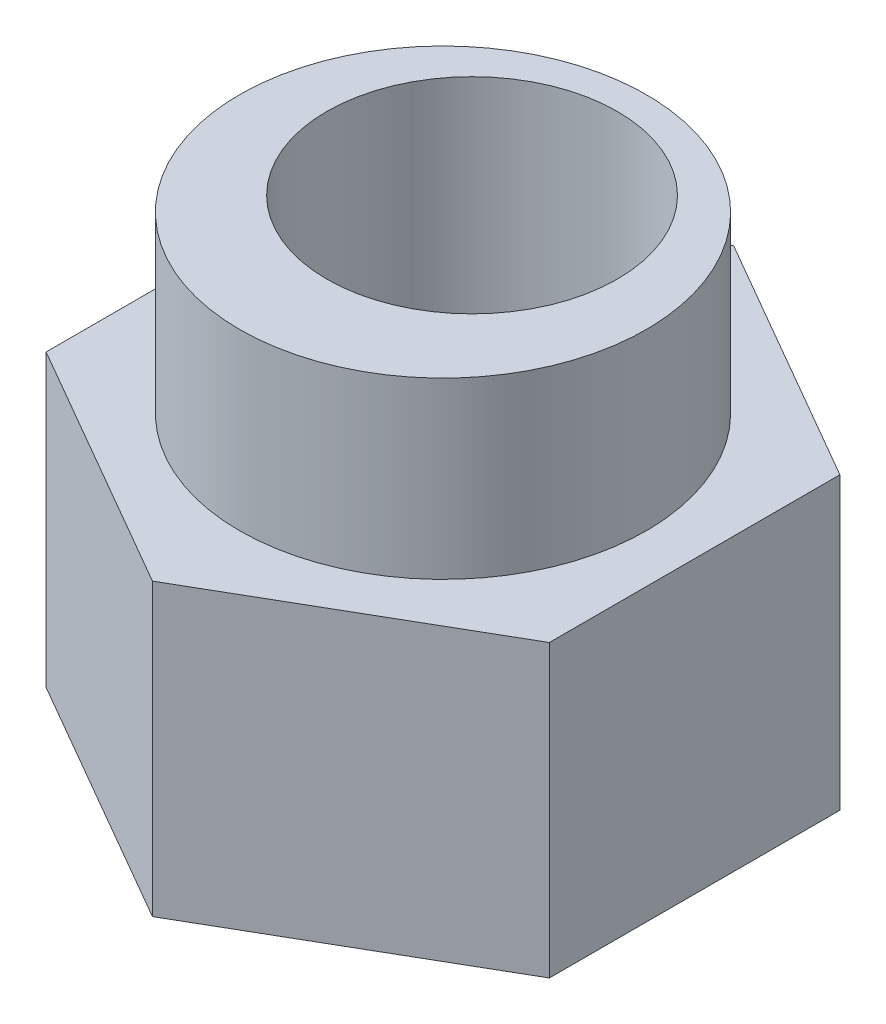
ISO-10303-21;
HEADER;
FILE_DESCRIPTION(('STEP AP214'),'2;1');
FILE_NAME('part.step','',(''),(''),'','','');
FILE_SCHEMA(('AUTOMOTIVE_DESIGN { 1 0 10303 214 1 1 1 1 }'));
ENDSEC;
DATA;
#1=APPLICATION_CONTEXT('core data for automotive mechanical design processes');
#2=APPLICATION_PROTOCOL_DEFINITION('international standard','automotive_design',2000,#1);
#3=PRODUCT_CONTEXT('',#1,'mechanical');
#4=PRODUCT('Part','Part','',(#3));
#5=PRODUCT_RELATED_PRODUCT_CATEGORY('part','',(#4));
#6=PRODUCT_DEFINITION_FORMATION('','',#4);
#7=PRODUCT_DEFINITION_CONTEXT('part definition',#1,'design');
#8=PRODUCT_DEFINITION('design','',#6,#7);
#9=PRODUCT_DEFINITION_SHAPE('','',#8);
#10=(LENGTH_UNIT() NAMED_UNIT(*) SI_UNIT(.MILLI.,.METRE.));
#11=(NAMED_UNIT(*) PLANE_ANGLE_UNIT() SI_UNIT($,.RADIAN.));
#12=(NAMED_UNIT(*) SI_UNIT($,.STERADIAN.) SOLID_ANGLE_UNIT());
#13=UNCERTAINTY_MEASURE_WITH_UNIT(LENGTH_MEASURE(1.E-05),#10,'distance_accuracy_value','');
#14=(GEOMETRIC_REPRESENTATION_CONTEXT(3) GLOBAL_UNCERTAINTY_ASSIGNED_CONTEXT((#13)) GLOBAL_UNIT_ASSIGNED_CONTEXT((#10,
#11,#12)) REPRESENTATION_CONTEXT('',''));
#15=CARTESIAN_POINT('',(0.,0.,0.));
#16=DIRECTION('',(0.,0.,1.));
#17=DIRECTION('',(1.,0.,0.));
#18=AXIS2_PLACEMENT_3D('',#15,#16,#17);
#19=CARTESIAN_POINT('',(4.3301270189222,8.,2.5));
#20=DIRECTION('',(-1.,0.,0.));
#21=DIRECTION('',(0.,0.,1.));
#22=AXIS2_PLACEMENT_3D('',#19,#20,#21);
#23=PLANE('',#22);
#24=DIRECTION('',(0.,0.,-1.));
#25=VECTOR('',#24,1.);
#26=CARTESIAN_POINT('',(4.3301270189222,5.,2.5));
#27=LINE('',#26,#25);
#28=CARTESIAN_POINT('',(4.3301270189222,5.,2.5));
#29=VERTEX_POINT('',#28);
#30=CARTESIAN_POINT('',(4.3301270189222,5.,-2.5));
#31=VERTEX_POINT('',#30);
#32=EDGE_CURVE('E160',#29,#31,#27,.T.);
#33=ORIENTED_EDGE('',*,*,#32,.F.);
#34=DIRECTION('',(0.,-1.,0.));
#35=VECTOR('',#34,1.);
#36=CARTESIAN_POINT('',(4.3301270189222,8.,2.5));
#37=LINE('',#36,#35);
#38=CARTESIAN_POINT('',(4.3301270189222,0.,2.5));
#39=VERTEX_POINT('',#38);
#40=EDGE_CURVE('E66',#29,#39,#37,.T.);
#41=ORIENTED_EDGE('',*,*,#40,.T.);
#42=DIRECTION('',(0.,0.,-1.));
#43=VECTOR('',#42,1.);
#44=CARTESIAN_POINT('',(4.3301270189222,0.,2.5));
#45=LINE('',#44,#43);
#46=CARTESIAN_POINT('',(4.3301270189222,0.,-2.5));
#47=VERTEX_POINT('',#46);
#48=EDGE_CURVE('E147',#39,#47,#45,.T.);
#49=ORIENTED_EDGE('',*,*,#48,.T.);
#50=DIRECTION('',(0.,-1.,0.));
#51=VECTOR('',#50,1.);
#52=CARTESIAN_POINT('',(4.3301270189222,8.,-2.5));
#53=LINE('',#52,#51);
#54=EDGE_CURVE('E11',#31,#47,#53,.T.);
#55=ORIENTED_EDGE('',*,*,#54,.F.);
#56=EDGE_LOOP('',(#33,#41,#49,#55));
#57=FACE_BOUND('',#56,.T.);
#58=ADVANCED_FACE('F43',(#57),#23,.F.);
#59=CARTESIAN_POINT('',(4.3301270189222,8.,-2.5));
#60=DIRECTION('',(-0.5,0.,0.866025403784439));
#61=DIRECTION('',(0.866025403784438,0.,0.5));
#62=AXIS2_PLACEMENT_3D('',#59,#60,#61);
#63=PLANE('',#62);
#64=DIRECTION('',(-0.866025403784438,0.,-0.5));
#65=VECTOR('',#64,1.);
#66=CARTESIAN_POINT('',(4.3301270189222,5.,-2.5));
#67=LINE('',#66,#65);
#68=CARTESIAN_POINT('',(0.,5.,-5.));
#69=VERTEX_POINT('',#68);
#70=EDGE_CURVE('E100',#31,#69,#67,.T.);
#71=ORIENTED_EDGE('',*,*,#70,.F.);
#72=ORIENTED_EDGE('',*,*,#54,.T.);
#73=DIRECTION('',(-0.866025403784438,0.,-0.5));
#74=VECTOR('',#73,1.);
#75=CARTESIAN_POINT('',(4.3301270189222,0.,-2.5));
#76=LINE('',#75,#74);
#77=CARTESIAN_POINT('',(0.,0.,-5.));
#78=VERTEX_POINT('',#77);
#79=EDGE_CURVE('E143',#47,#78,#76,.T.);
#80=ORIENTED_EDGE('',*,*,#79,.T.);
#81=DIRECTION('',(0.,-1.,0.));
#82=VECTOR('',#81,1.);
#83=CARTESIAN_POINT('',(0.,8.,-5.));
#84=LINE('',#83,#82);
#85=EDGE_CURVE('E51',#69,#78,#84,.T.);
#86=ORIENTED_EDGE('',*,*,#85,.F.);
#87=EDGE_LOOP('',(#71,#72,#80,#86));
#88=FACE_BOUND('',#87,.T.);
#89=ADVANCED_FACE('F191',(#88),#63,.F.);
#90=CARTESIAN_POINT('',(0.,8.,-5.));
#91=DIRECTION('',(0.5,0.,0.866025403784438));
#92=DIRECTION('',(0.866025403784438,0.,-0.5));
#93=AXIS2_PLACEMENT_3D('',#90,#91,#92);
#94=PLANE('',#93);
#95=DIRECTION('',(-0.866025403784438,0.,0.5));
#96=VECTOR('',#95,1.);
#97=CARTESIAN_POINT('',(0.,5.,-5.));
#98=LINE('',#97,#96);
#99=CARTESIAN_POINT('',(-4.3301270189222,5.,-2.5));
#100=VERTEX_POINT('',#99);
#101=EDGE_CURVE('E95',#69,#100,#98,.T.);
#102=ORIENTED_EDGE('',*,*,#101,.F.);
#103=ORIENTED_EDGE('',*,*,#85,.T.);
#104=DIRECTION('',(-0.866025403784438,0.,0.5));
#105=VECTOR('',#104,1.);
#106=CARTESIAN_POINT('',(0.,0.,-5.));
#107=LINE('',#106,#105);
#108=CARTESIAN_POINT('',(-4.3301270189222,0.,-2.5));
#109=VERTEX_POINT('',#108);
#110=EDGE_CURVE('E118',#78,#109,#107,.T.);
#111=ORIENTED_EDGE('',*,*,#110,.T.);
#112=DIRECTION('',(0.,-1.,0.));
#113=VECTOR('',#112,1.);
#114=CARTESIAN_POINT('',(-4.3301270189222,8.,-2.5));
#115=LINE('',#114,#113);
#116=EDGE_CURVE('E111',#100,#109,#115,.T.);
#117=ORIENTED_EDGE('',*,*,#116,.F.);
#118=EDGE_LOOP('',(#102,#103,#111,#117));
#119=FACE_BOUND('',#118,.T.);
#120=ADVANCED_FACE('F116',(#119),#94,.F.);
#121=CARTESIAN_POINT('',(-4.3301270189222,8.,-2.5));
#122=DIRECTION('',(1.,0.,0.));
#123=DIRECTION('',(0.,0.,-1.));
#124=AXIS2_PLACEMENT_3D('',#121,#122,#123);
#125=PLANE('',#124);
#126=DIRECTION('',(0.,0.,1.));
#127=VECTOR('',#126,1.);
#128=CARTESIAN_POINT('',(-4.3301270189222,5.,-2.5));
#129=LINE('',#128,#127);
#130=CARTESIAN_POINT('',(-4.33012701892219,5.,2.5));
#131=VERTEX_POINT('',#130);
#132=EDGE_CURVE('E98',#100,#131,#129,.T.);
#133=ORIENTED_EDGE('',*,*,#132,.F.);
#134=ORIENTED_EDGE('',*,*,#116,.T.);
#135=DIRECTION('',(0.,0.,1.));
#136=VECTOR('',#135,1.);
#137=CARTESIAN_POINT('',(-4.3301270189222,0.,-2.5));
#138=LINE('',#137,#136);
#139=CARTESIAN_POINT('',(-4.33012701892219,0.,2.5));
#140=VERTEX_POINT('',#139);
#141=EDGE_CURVE('E138',#109,#140,#138,.T.);
#142=ORIENTED_EDGE('',*,*,#141,.T.);
#143=DIRECTION('',(0.,-1.,0.));
#144=VECTOR('',#143,1.);
#145=CARTESIAN_POINT('',(-4.33012701892219,8.,2.5));
#146=LINE('',#145,#144);
#147=EDGE_CURVE('E113',#131,#140,#146,.T.);
#148=ORIENTED_EDGE('',*,*,#147,.F.);
#149=EDGE_LOOP('',(#133,#134,#142,#148));
#150=FACE_BOUND('',#149,.T.);
#151=ADVANCED_FACE('F109',(#150),#125,.F.);
#152=CARTESIAN_POINT('',(-4.33012701892219,8.,2.5));
#153=DIRECTION('',(0.5,0.,-0.866025403784439));
#154=DIRECTION('',(-0.866025403784439,0.,-0.5));
#155=AXIS2_PLACEMENT_3D('',#152,#153,#154);
#156=PLANE('',#155);
#157=DIRECTION('',(0.866025403784439,0.,0.5));
#158=VECTOR('',#157,1.);
#159=CARTESIAN_POINT('',(-4.33012701892219,5.,2.5));
#160=LINE('',#159,#158);
#161=CARTESIAN_POINT('',(0.,5.,5.));
#162=VERTEX_POINT('',#161);
#163=EDGE_CURVE('E58',#131,#162,#160,.T.);
#164=ORIENTED_EDGE('',*,*,#163,.F.);
#165=ORIENTED_EDGE('',*,*,#147,.T.);
#166=DIRECTION('',(0.866025403784439,0.,0.5));
#167=VECTOR('',#166,1.);
#168=CARTESIAN_POINT('',(-4.33012701892219,0.,2.5));
#169=LINE('',#168,#167);
#170=CARTESIAN_POINT('',(0.,0.,5.));
#171=VERTEX_POINT('',#170);
#172=EDGE_CURVE('E134',#140,#171,#169,.T.);
#173=ORIENTED_EDGE('',*,*,#172,.T.);
#174=DIRECTION('',(0.,-1.,0.));
#175=VECTOR('',#174,1.);
#176=CARTESIAN_POINT('',(0.,8.,5.));
#177=LINE('',#176,#175);
#178=EDGE_CURVE('E124',#162,#171,#177,.T.);
#179=ORIENTED_EDGE('',*,*,#178,.F.);
#180=EDGE_LOOP('',(#164,#165,#173,#179));
#181=FACE_BOUND('',#180,.T.);
#182=ADVANCED_FACE('F206',(#181),#156,.F.);
#183=CARTESIAN_POINT('',(0.,8.,5.));
#184=DIRECTION('',(-0.5,0.,-0.866025403784439));
#185=DIRECTION('',(-0.866025403784439,0.,0.5));
#186=AXIS2_PLACEMENT_3D('',#183,#184,#185);
#187=PLANE('',#186);
#188=DIRECTION('',(0.866025403784438,0.,-0.5));
#189=VECTOR('',#188,1.);
#190=CARTESIAN_POINT('',(0.,5.,5.));
#191=LINE('',#190,#189);
#192=EDGE_CURVE('E163',#162,#29,#191,.T.);
#193=ORIENTED_EDGE('',*,*,#192,.F.);
#194=ORIENTED_EDGE('',*,*,#178,.T.);
#195=DIRECTION('',(0.866025403784438,0.,-0.5));
#196=VECTOR('',#195,1.);
#197=CARTESIAN_POINT('',(0.,0.,5.));
#198=LINE('',#197,#196);
#199=EDGE_CURVE('E131',#171,#39,#198,.T.);
#200=ORIENTED_EDGE('',*,*,#199,.T.);
#201=ORIENTED_EDGE('',*,*,#40,.F.);
#202=EDGE_LOOP('',(#193,#194,#200,#201));
#203=FACE_BOUND('',#202,.T.);
#204=ADVANCED_FACE('F198',(#203),#187,.F.);
#205=CARTESIAN_POINT('',(0.,8.,0.));
#206=DIRECTION('',(0.,1.,0.));
#207=DIRECTION('',(0.,0.,1.));
#208=AXIS2_PLACEMENT_3D('',#205,#206,#207);
#209=PLANE('',#208);
#210=CARTESIAN_POINT('',(0.,8.,-0.500000000000004));
#211=DIRECTION('',(0.,1.,0.));
#212=DIRECTION('',(0.,0.,1.));
#213=AXIS2_PLACEMENT_3D('',#210,#211,#212);
#214=CIRCLE('',#213,2.5);
#215=CARTESIAN_POINT('',(0.,8.,2.));
#216=VERTEX_POINT('',#215);
#217=EDGE_CURVE('E151',#216,#216,#214,.T.);
#218=ORIENTED_EDGE('',*,*,#217,.F.);
#219=EDGE_LOOP('',(#218));
#220=FACE_BOUND('',#219,.T.);
#221=CARTESIAN_POINT('',(0.,8.,0.));
#222=DIRECTION('',(0.,1.,0.));
#223=DIRECTION('',(0.,0.,1.));
#224=AXIS2_PLACEMENT_3D('',#221,#222,#223);
#225=CIRCLE('',#224,3.5);
#226=CARTESIAN_POINT('',(0.,8.,3.5));
#227=VERTEX_POINT('',#226);
#228=EDGE_CURVE('E168',#227,#227,#225,.T.);
#229=ORIENTED_EDGE('',*,*,#228,.T.);
#230=EDGE_LOOP('',(#229));
#231=FACE_BOUND('',#230,.T.);
#232=ADVANCED_FACE('F213',(#220,#231),#209,.T.);
#233=CARTESIAN_POINT('',(0.,0.,0.));
#234=DIRECTION('',(0.,1.,0.));
#235=DIRECTION('',(0.,0.,1.));
#236=AXIS2_PLACEMENT_3D('',#233,#234,#235);
#237=PLANE('',#236);
#238=CARTESIAN_POINT('',(0.,0.,-0.500000000000004));
#239=DIRECTION('',(0.,1.,0.));
#240=DIRECTION('',(0.,0.,1.));
#241=AXIS2_PLACEMENT_3D('',#238,#239,#240);
#242=CIRCLE('',#241,2.5);
#243=CARTESIAN_POINT('',(0.,0.,2.));
#244=VERTEX_POINT('',#243);
#245=EDGE_CURVE('E150',#244,#244,#242,.T.);
#246=ORIENTED_EDGE('',*,*,#245,.T.);
#247=EDGE_LOOP('',(#246));
#248=FACE_BOUND('',#247,.T.);
#249=ORIENTED_EDGE('',*,*,#48,.F.);
#250=ORIENTED_EDGE('',*,*,#199,.F.);
#251=ORIENTED_EDGE('',*,*,#172,.F.);
#252=ORIENTED_EDGE('',*,*,#141,.F.);
#253=ORIENTED_EDGE('',*,*,#110,.F.);
#254=ORIENTED_EDGE('',*,*,#79,.F.);
#255=EDGE_LOOP('',(#249,#250,#251,#252,#253,#254));
#256=FACE_BOUND('',#255,.T.);
#257=ADVANCED_FACE('F187',(#248,#256),#237,.F.);
#258=CARTESIAN_POINT('',(0.,0.,-0.500000000000004));
#259=DIRECTION('',(0.,1.,0.));
#260=DIRECTION('',(0.,0.,1.));
#261=AXIS2_PLACEMENT_3D('',#258,#259,#260);
#262=CYLINDRICAL_SURFACE('',#261,2.5);
#263=ORIENTED_EDGE('',*,*,#245,.F.);
#264=EDGE_LOOP('',(#263));
#265=FACE_BOUND('',#264,.T.);
#266=ORIENTED_EDGE('',*,*,#217,.T.);
#267=EDGE_LOOP('',(#266));
#268=FACE_BOUND('',#267,.T.);
#269=ADVANCED_FACE('F180',(#265,#268),#262,.F.);
#270=CARTESIAN_POINT('',(0.,5.,0.));
#271=DIRECTION('',(0.,1.,0.));
#272=DIRECTION('',(0.,0.,1.));
#273=AXIS2_PLACEMENT_3D('',#270,#271,#272);
#274=PLANE('',#273);
#275=CARTESIAN_POINT('',(0.,5.,0.));
#276=DIRECTION('',(0.,1.,0.));
#277=DIRECTION('',(0.,0.,1.));
#278=AXIS2_PLACEMENT_3D('',#275,#276,#277);
#279=CIRCLE('',#278,3.5);
#280=CARTESIAN_POINT('',(0.,5.,3.5));
#281=VERTEX_POINT('',#280);
#282=EDGE_CURVE('E105',#281,#281,#279,.T.);
#283=ORIENTED_EDGE('',*,*,#282,.F.);
#284=EDGE_LOOP('',(#283));
#285=FACE_BOUND('',#284,.T.);
#286=ORIENTED_EDGE('',*,*,#101,.T.);
#287=ORIENTED_EDGE('',*,*,#132,.T.);
#288=ORIENTED_EDGE('',*,*,#163,.T.);
#289=ORIENTED_EDGE('',*,*,#192,.T.);
#290=ORIENTED_EDGE('',*,*,#32,.T.);
#291=ORIENTED_EDGE('',*,*,#70,.T.);
#292=EDGE_LOOP('',(#286,#287,#288,#289,#290,#291));
#293=FACE_BOUND('',#292,.T.);
#294=ADVANCED_FACE('F97',(#285,#293),#274,.T.);
#295=CARTESIAN_POINT('',(0.,5.,0.));
#296=DIRECTION('',(0.,1.,0.));
#297=DIRECTION('',(0.,0.,1.));
#298=AXIS2_PLACEMENT_3D('',#295,#296,#297);
#299=CYLINDRICAL_SURFACE('',#298,3.5);
#300=ORIENTED_EDGE('',*,*,#282,.T.);
#301=EDGE_LOOP('',(#300));
#302=FACE_BOUND('',#301,.T.);
#303=ORIENTED_EDGE('',*,*,#228,.F.);
#304=EDGE_LOOP('',(#303));
#305=FACE_BOUND('',#304,.T.);
#306=ADVANCED_FACE('F176',(#302,#305),#299,.T.);
#307=CLOSED_SHELL('',(#58,#89,#120,#151,#182,#204,#232,#257,#269,#294,#306));
#308=MANIFOLD_SOLID_BREP('B2',#307);
#309=ADVANCED_BREP_SHAPE_REPRESENTATION('',(#18,#308),#14);
#310=SHAPE_DEFINITION_REPRESENTATION(#9,#309);
ENDSEC;
END-ISO-10303-21;
